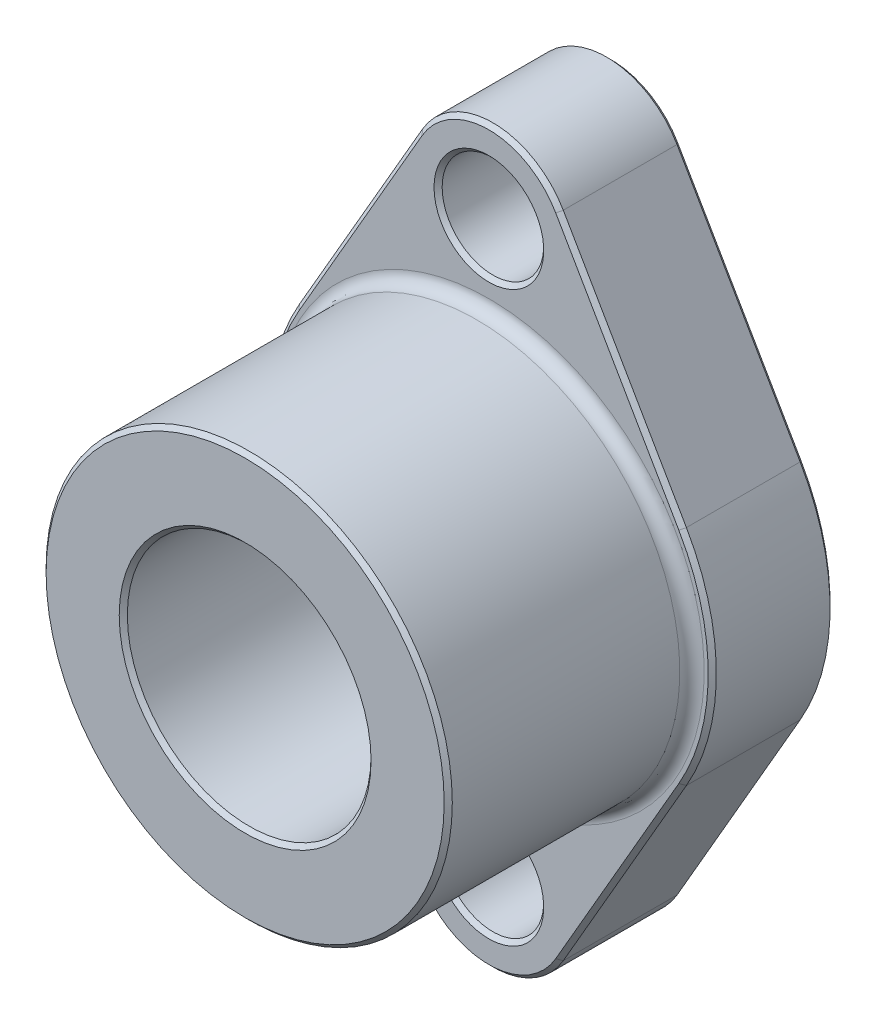
ISO-10303-21;
HEADER;
FILE_DESCRIPTION(('STEP AP214'),'2;1');
FILE_NAME('part.step','',(''),(''),'','','');
FILE_SCHEMA(('AUTOMOTIVE_DESIGN { 1 0 10303 214 1 1 1 1 }'));
ENDSEC;
DATA;
#1=APPLICATION_CONTEXT('core data for automotive mechanical design processes');
#2=APPLICATION_PROTOCOL_DEFINITION('international standard','automotive_design',2000,#1);
#3=PRODUCT_CONTEXT('',#1,'mechanical');
#4=PRODUCT('Part','Part','',(#3));
#5=PRODUCT_RELATED_PRODUCT_CATEGORY('part','',(#4));
#6=PRODUCT_DEFINITION_FORMATION('','',#4);
#7=PRODUCT_DEFINITION_CONTEXT('part definition',#1,'design');
#8=PRODUCT_DEFINITION('design','',#6,#7);
#9=PRODUCT_DEFINITION_SHAPE('','',#8);
#10=(LENGTH_UNIT() NAMED_UNIT(*) SI_UNIT(.MILLI.,.METRE.));
#11=(NAMED_UNIT(*) PLANE_ANGLE_UNIT() SI_UNIT($,.RADIAN.));
#12=(NAMED_UNIT(*) SI_UNIT($,.STERADIAN.) SOLID_ANGLE_UNIT());
#13=UNCERTAINTY_MEASURE_WITH_UNIT(LENGTH_MEASURE(1.E-05),#10,'distance_accuracy_value','');
#14=(GEOMETRIC_REPRESENTATION_CONTEXT(3) GLOBAL_UNCERTAINTY_ASSIGNED_CONTEXT((#13)) GLOBAL_UNIT_ASSIGNED_CONTEXT((#10,
#11,#12)) REPRESENTATION_CONTEXT('',''));
#15=CARTESIAN_POINT('',(0.,0.,0.));
#16=DIRECTION('',(0.,0.,1.));
#17=DIRECTION('',(1.,0.,0.));
#18=AXIS2_PLACEMENT_3D('',#15,#16,#17);
#19=CARTESIAN_POINT('',(0.,0.,6.));
#20=DIRECTION('',(0.,0.,-1.));
#21=DIRECTION('',(-1.,0.,0.));
#22=AXIS2_PLACEMENT_3D('',#19,#20,#21);
#23=CYLINDRICAL_SURFACE('',#22,5.);
#24=CARTESIAN_POINT('',(0.,0.,5.9));
#25=DIRECTION('',(0.,0.,1.));
#26=DIRECTION('',(1.,0.,0.));
#27=AXIS2_PLACEMENT_3D('',#24,#25,#26);
#28=CIRCLE('',#27,5.);
#29=CARTESIAN_POINT('',(5.,0.,5.9));
#30=VERTEX_POINT('',#29);
#31=EDGE_CURVE('E257',#30,#30,#28,.F.);
#32=ORIENTED_EDGE('',*,*,#31,.T.);
#33=EDGE_LOOP('',(#32));
#34=FACE_BOUND('',#33,.T.);
#35=CARTESIAN_POINT('',(0.,0.,0.3));
#36=DIRECTION('',(0.,0.,-1.));
#37=DIRECTION('',(-1.,0.,0.));
#38=AXIS2_PLACEMENT_3D('',#35,#36,#37);
#39=CIRCLE('',#38,5.);
#40=CARTESIAN_POINT('',(-5.,0.,0.3));
#41=VERTEX_POINT('',#40);
#42=EDGE_CURVE('E338',#41,#41,#39,.F.);
#43=ORIENTED_EDGE('',*,*,#42,.T.);
#44=EDGE_LOOP('',(#43));
#45=FACE_BOUND('',#44,.T.);
#46=ADVANCED_FACE('F39',(#34,#45),#23,.T.);
#47=CARTESIAN_POINT('',(0.,0.,6.));
#48=DIRECTION('',(0.,0.,1.));
#49=DIRECTION('',(1.,0.,0.));
#50=AXIS2_PLACEMENT_3D('',#47,#48,#49);
#51=PLANE('',#50);
#52=CARTESIAN_POINT('',(0.,0.,6.));
#53=DIRECTION('',(0.,0.,1.));
#54=DIRECTION('',(1.,0.,0.));
#55=AXIS2_PLACEMENT_3D('',#52,#53,#54);
#56=CIRCLE('',#55,4.9);
#57=CARTESIAN_POINT('',(4.9,0.,6.));
#58=VERTEX_POINT('',#57);
#59=EDGE_CURVE('E254',#58,#58,#56,.T.);
#60=ORIENTED_EDGE('',*,*,#59,.T.);
#61=EDGE_LOOP('',(#60));
#62=FACE_BOUND('',#61,.T.);
#63=CARTESIAN_POINT('',(0.,0.,6.));
#64=DIRECTION('',(0.,0.,1.));
#65=DIRECTION('',(1.,0.,0.));
#66=AXIS2_PLACEMENT_3D('',#63,#64,#65);
#67=CIRCLE('',#66,3.1);
#68=CARTESIAN_POINT('',(3.1,0.,6.));
#69=VERTEX_POINT('',#68);
#70=EDGE_CURVE('E251',#69,#69,#67,.F.);
#71=ORIENTED_EDGE('',*,*,#70,.T.);
#72=EDGE_LOOP('',(#71));
#73=FACE_BOUND('',#72,.T.);
#74=ADVANCED_FACE('F424',(#62,#73),#51,.T.);
#75=CARTESIAN_POINT('',(0.,0.,-3.));
#76=DIRECTION('',(0.,0.,1.));
#77=DIRECTION('',(1.,0.,0.));
#78=AXIS2_PLACEMENT_3D('',#75,#76,#77);
#79=CYLINDRICAL_SURFACE('',#78,5.5);
#80=DIRECTION('',(0.,0.,1.));
#81=VECTOR('',#80,1.);
#82=CARTESIAN_POINT('',(4.76313972081441,-2.75,-3.));
#83=LINE('',#82,#81);
#84=CARTESIAN_POINT('',(4.76313972081441,-2.75,-2.9));
#85=VERTEX_POINT('',#84);
#86=CARTESIAN_POINT('',(4.76313972081441,-2.75,-0.100000000000003));
#87=VERTEX_POINT('',#86);
#88=EDGE_CURVE('E331',#85,#87,#83,.T.);
#89=ORIENTED_EDGE('',*,*,#88,.F.);
#90=CARTESIAN_POINT('',(0.,0.,-2.9));
#91=DIRECTION('',(0.,0.,-1.));
#92=DIRECTION('',(-1.,0.,0.));
#93=AXIS2_PLACEMENT_3D('',#90,#91,#92);
#94=CIRCLE('',#93,5.5);
#95=CARTESIAN_POINT('',(4.76313972081441,2.75,-2.9));
#96=VERTEX_POINT('',#95);
#97=EDGE_CURVE('E217',#85,#96,#94,.F.);
#98=ORIENTED_EDGE('',*,*,#97,.T.);
#99=DIRECTION('',(0.,0.,1.));
#100=VECTOR('',#99,1.);
#101=CARTESIAN_POINT('',(4.76313972081441,2.75,-3.));
#102=LINE('',#101,#100);
#103=CARTESIAN_POINT('',(4.76313972081441,2.75,-0.100000000000003));
#104=VERTEX_POINT('',#103);
#105=EDGE_CURVE('E279',#96,#104,#102,.T.);
#106=ORIENTED_EDGE('',*,*,#105,.T.);
#107=CARTESIAN_POINT('',(0.,0.,-0.100000000000003));
#108=DIRECTION('',(0.,0.,-1.));
#109=DIRECTION('',(-1.,0.,0.));
#110=AXIS2_PLACEMENT_3D('',#107,#108,#109);
#111=CIRCLE('',#110,5.5);
#112=EDGE_CURVE('E215',#104,#87,#111,.T.);
#113=ORIENTED_EDGE('',*,*,#112,.T.);
#114=EDGE_LOOP('',(#89,#98,#106,#113));
#115=FACE_BOUND('',#114,.T.);
#116=ADVANCED_FACE('F330',(#115),#79,.T.);
#117=CARTESIAN_POINT('',(4.76313972081441,-2.75,-3.));
#118=DIRECTION('',(-0.866025403784439,0.5,0.));
#119=DIRECTION('',(-0.5,-0.866025403784439,0.));
#120=AXIS2_PLACEMENT_3D('',#117,#118,#119);
#121=PLANE('',#120);
#122=DIRECTION('',(0.,0.,1.));
#123=VECTOR('',#122,1.);
#124=CARTESIAN_POINT('',(1.73205080756888,-8.,-3.));
#125=LINE('',#124,#123);
#126=CARTESIAN_POINT('',(1.73205080756888,-8.,-2.9));
#127=VERTEX_POINT('',#126);
#128=CARTESIAN_POINT('',(1.73205080756888,-8.,-0.100000000000003));
#129=VERTEX_POINT('',#128);
#130=EDGE_CURVE('E339',#127,#129,#125,.T.);
#131=ORIENTED_EDGE('',*,*,#130,.F.);
#132=DIRECTION('',(0.5,0.866025403784439,0.));
#133=VECTOR('',#132,1.);
#134=CARTESIAN_POINT('',(4.76313972081441,-2.75,-2.9));
#135=LINE('',#134,#133);
#136=EDGE_CURVE('E213',#127,#85,#135,.T.);
#137=ORIENTED_EDGE('',*,*,#136,.T.);
#138=ORIENTED_EDGE('',*,*,#88,.T.);
#139=DIRECTION('',(-0.5,-0.866025403784439,0.));
#140=VECTOR('',#139,1.);
#141=CARTESIAN_POINT('',(4.76313972081441,-2.75,-0.100000000000003));
#142=LINE('',#141,#140);
#143=EDGE_CURVE('E210',#87,#129,#142,.T.);
#144=ORIENTED_EDGE('',*,*,#143,.T.);
#145=EDGE_LOOP('',(#131,#137,#138,#144));
#146=FACE_BOUND('',#145,.T.);
#147=ADVANCED_FACE('F335',(#146),#121,.F.);
#148=CARTESIAN_POINT('',(0.,-7.,-3.));
#149=DIRECTION('',(0.,0.,1.));
#150=DIRECTION('',(1.,0.,0.));
#151=AXIS2_PLACEMENT_3D('',#148,#149,#150);
#152=CYLINDRICAL_SURFACE('',#151,2.);
#153=DIRECTION('',(0.,0.,1.));
#154=VECTOR('',#153,1.);
#155=CARTESIAN_POINT('',(-1.73205080756888,-8.,-3.));
#156=LINE('',#155,#154);
#157=CARTESIAN_POINT('',(-1.73205080756888,-8.,-2.9));
#158=VERTEX_POINT('',#157);
#159=CARTESIAN_POINT('',(-1.73205080756888,-8.,-0.100000000000003));
#160=VERTEX_POINT('',#159);
#161=EDGE_CURVE('E344',#158,#160,#156,.T.);
#162=ORIENTED_EDGE('',*,*,#161,.F.);
#163=CARTESIAN_POINT('',(0.,-7.,-2.9));
#164=DIRECTION('',(0.,0.,-1.));
#165=DIRECTION('',(-1.,0.,0.));
#166=AXIS2_PLACEMENT_3D('',#163,#164,#165);
#167=CIRCLE('',#166,2.);
#168=EDGE_CURVE('E208',#158,#127,#167,.F.);
#169=ORIENTED_EDGE('',*,*,#168,.T.);
#170=ORIENTED_EDGE('',*,*,#130,.T.);
#171=CARTESIAN_POINT('',(0.,-7.,-0.100000000000003));
#172=DIRECTION('',(0.,0.,-1.));
#173=DIRECTION('',(-1.,0.,0.));
#174=AXIS2_PLACEMENT_3D('',#171,#172,#173);
#175=CIRCLE('',#174,2.);
#176=EDGE_CURVE('E206',#129,#160,#175,.T.);
#177=ORIENTED_EDGE('',*,*,#176,.T.);
#178=EDGE_LOOP('',(#162,#169,#170,#177));
#179=FACE_BOUND('',#178,.T.);
#180=ADVANCED_FACE('F551',(#179),#152,.T.);
#181=CARTESIAN_POINT('',(-4.76313972081441,-2.75,-3.));
#182=DIRECTION('',(0.866025403784439,0.5,0.));
#183=DIRECTION('',(-0.5,0.866025403784439,0.));
#184=AXIS2_PLACEMENT_3D('',#181,#182,#183);
#185=PLANE('',#184);
#186=DIRECTION('',(0.,0.,1.));
#187=VECTOR('',#186,1.);
#188=CARTESIAN_POINT('',(-4.76313972081441,-2.75,-3.));
#189=LINE('',#188,#187);
#190=CARTESIAN_POINT('',(-4.76313972081441,-2.75,-2.9));
#191=VERTEX_POINT('',#190);
#192=CARTESIAN_POINT('',(-4.76313972081441,-2.75,-0.100000000000003));
#193=VERTEX_POINT('',#192);
#194=EDGE_CURVE('E391',#191,#193,#189,.T.);
#195=ORIENTED_EDGE('',*,*,#194,.F.);
#196=DIRECTION('',(0.5,-0.866025403784439,0.));
#197=VECTOR('',#196,1.);
#198=CARTESIAN_POINT('',(-1.73205080756888,-8.,-2.9));
#199=LINE('',#198,#197);
#200=EDGE_CURVE('E204',#191,#158,#199,.T.);
#201=ORIENTED_EDGE('',*,*,#200,.T.);
#202=ORIENTED_EDGE('',*,*,#161,.T.);
#203=DIRECTION('',(-0.5,0.866025403784439,0.));
#204=VECTOR('',#203,1.);
#205=CARTESIAN_POINT('',(-4.76313972081441,-2.75,-0.100000000000003));
#206=LINE('',#205,#204);
#207=EDGE_CURVE('E202',#160,#193,#206,.T.);
#208=ORIENTED_EDGE('',*,*,#207,.T.);
#209=EDGE_LOOP('',(#195,#201,#202,#208));
#210=FACE_BOUND('',#209,.T.);
#211=ADVANCED_FACE('F398',(#210),#185,.F.);
#212=CARTESIAN_POINT('',(0.,0.,-3.));
#213=DIRECTION('',(0.,0.,1.));
#214=DIRECTION('',(1.,0.,0.));
#215=AXIS2_PLACEMENT_3D('',#212,#213,#214);
#216=CYLINDRICAL_SURFACE('',#215,5.5);
#217=DIRECTION('',(0.,0.,1.));
#218=VECTOR('',#217,1.);
#219=CARTESIAN_POINT('',(-4.76313972081441,2.75,-3.));
#220=LINE('',#219,#218);
#221=CARTESIAN_POINT('',(-4.76313972081441,2.75,-2.9));
#222=VERTEX_POINT('',#221);
#223=CARTESIAN_POINT('',(-4.76313972081441,2.75,-0.100000000000003));
#224=VERTEX_POINT('',#223);
#225=EDGE_CURVE('E385',#222,#224,#220,.T.);
#226=ORIENTED_EDGE('',*,*,#225,.F.);
#227=CARTESIAN_POINT('',(0.,0.,-2.9));
#228=DIRECTION('',(0.,0.,-1.));
#229=DIRECTION('',(-1.,0.,0.));
#230=AXIS2_PLACEMENT_3D('',#227,#228,#229);
#231=CIRCLE('',#230,5.5);
#232=EDGE_CURVE('E200',#222,#191,#231,.F.);
#233=ORIENTED_EDGE('',*,*,#232,.T.);
#234=ORIENTED_EDGE('',*,*,#194,.T.);
#235=CARTESIAN_POINT('',(0.,0.,-0.100000000000003));
#236=DIRECTION('',(0.,0.,-1.));
#237=DIRECTION('',(-1.,0.,0.));
#238=AXIS2_PLACEMENT_3D('',#235,#236,#237);
#239=CIRCLE('',#238,5.5);
#240=EDGE_CURVE('E198',#193,#224,#239,.T.);
#241=ORIENTED_EDGE('',*,*,#240,.T.);
#242=EDGE_LOOP('',(#226,#233,#234,#241));
#243=FACE_BOUND('',#242,.T.);
#244=ADVANCED_FACE('F544',(#243),#216,.T.);
#245=CARTESIAN_POINT('',(-4.76313972081441,2.75,-3.));
#246=DIRECTION('',(0.866025403784439,-0.5,0.));
#247=DIRECTION('',(0.5,0.866025403784439,0.));
#248=AXIS2_PLACEMENT_3D('',#245,#246,#247);
#249=PLANE('',#248);
#250=DIRECTION('',(0.,0.,1.));
#251=VECTOR('',#250,1.);
#252=CARTESIAN_POINT('',(-1.73205080756888,8.,-3.));
#253=LINE('',#252,#251);
#254=CARTESIAN_POINT('',(-1.73205080756888,8.,-2.9));
#255=VERTEX_POINT('',#254);
#256=CARTESIAN_POINT('',(-1.73205080756888,8.,-0.100000000000003));
#257=VERTEX_POINT('',#256);
#258=EDGE_CURVE('E383',#255,#257,#253,.T.);
#259=ORIENTED_EDGE('',*,*,#258,.F.);
#260=DIRECTION('',(-0.5,-0.866025403784439,0.));
#261=VECTOR('',#260,1.);
#262=CARTESIAN_POINT('',(-4.76313972081441,2.75,-2.9));
#263=LINE('',#262,#261);
#264=EDGE_CURVE('E196',#255,#222,#263,.T.);
#265=ORIENTED_EDGE('',*,*,#264,.T.);
#266=ORIENTED_EDGE('',*,*,#225,.T.);
#267=DIRECTION('',(0.5,0.866025403784439,0.));
#268=VECTOR('',#267,1.);
#269=CARTESIAN_POINT('',(-4.76313972081441,2.75,-0.100000000000003));
#270=LINE('',#269,#268);
#271=EDGE_CURVE('E194',#224,#257,#270,.T.);
#272=ORIENTED_EDGE('',*,*,#271,.T.);
#273=EDGE_LOOP('',(#259,#265,#266,#272));
#274=FACE_BOUND('',#273,.T.);
#275=ADVANCED_FACE('F541',(#274),#249,.F.);
#276=CARTESIAN_POINT('',(0.,7.,-3.));
#277=DIRECTION('',(0.,0.,1.));
#278=DIRECTION('',(1.,0.,0.));
#279=AXIS2_PLACEMENT_3D('',#276,#277,#278);
#280=CYLINDRICAL_SURFACE('',#279,2.);
#281=DIRECTION('',(0.,0.,1.));
#282=VECTOR('',#281,1.);
#283=CARTESIAN_POINT('',(1.73205080756888,8.,-3.));
#284=LINE('',#283,#282);
#285=CARTESIAN_POINT('',(1.73205080756888,8.,-2.9));
#286=VERTEX_POINT('',#285);
#287=CARTESIAN_POINT('',(1.73205080756888,8.,-0.100000000000003));
#288=VERTEX_POINT('',#287);
#289=EDGE_CURVE('E381',#286,#288,#284,.T.);
#290=ORIENTED_EDGE('',*,*,#289,.F.);
#291=CARTESIAN_POINT('',(0.,7.,-2.9));
#292=DIRECTION('',(0.,0.,-1.));
#293=DIRECTION('',(-1.,0.,0.));
#294=AXIS2_PLACEMENT_3D('',#291,#292,#293);
#295=CIRCLE('',#294,2.);
#296=EDGE_CURVE('E192',#286,#255,#295,.F.);
#297=ORIENTED_EDGE('',*,*,#296,.T.);
#298=ORIENTED_EDGE('',*,*,#258,.T.);
#299=CARTESIAN_POINT('',(0.,7.,-0.100000000000003));
#300=DIRECTION('',(0.,0.,-1.));
#301=DIRECTION('',(-1.,0.,0.));
#302=AXIS2_PLACEMENT_3D('',#299,#300,#301);
#303=CIRCLE('',#302,2.);
#304=EDGE_CURVE('E190',#257,#288,#303,.T.);
#305=ORIENTED_EDGE('',*,*,#304,.T.);
#306=EDGE_LOOP('',(#290,#297,#298,#305));
#307=FACE_BOUND('',#306,.T.);
#308=ADVANCED_FACE('F382',(#307),#280,.T.);
#309=CARTESIAN_POINT('',(4.76313972081441,2.75,-3.));
#310=DIRECTION('',(-0.866025403784439,-0.5,0.));
#311=DIRECTION('',(0.5,-0.866025403784439,0.));
#312=AXIS2_PLACEMENT_3D('',#309,#310,#311);
#313=PLANE('',#312);
#314=ORIENTED_EDGE('',*,*,#105,.F.);
#315=DIRECTION('',(-0.5,0.866025403784439,0.));
#316=VECTOR('',#315,1.);
#317=CARTESIAN_POINT('',(1.73205080756888,8.,-2.9));
#318=LINE('',#317,#316);
#319=EDGE_CURVE('E162',#96,#286,#318,.T.);
#320=ORIENTED_EDGE('',*,*,#319,.T.);
#321=ORIENTED_EDGE('',*,*,#289,.T.);
#322=DIRECTION('',(0.5,-0.866025403784439,0.));
#323=VECTOR('',#322,1.);
#324=CARTESIAN_POINT('',(4.76313972081441,2.75,-0.100000000000003));
#325=LINE('',#324,#323);
#326=EDGE_CURVE('E182',#288,#104,#325,.T.);
#327=ORIENTED_EDGE('',*,*,#326,.T.);
#328=EDGE_LOOP('',(#314,#320,#321,#327));
#329=FACE_BOUND('',#328,.T.);
#330=ADVANCED_FACE('F380',(#329),#313,.F.);
#331=CARTESIAN_POINT('',(0.,0.,-3.));
#332=DIRECTION('',(0.,0.,-1.));
#333=DIRECTION('',(-1.,0.,0.));
#334=AXIS2_PLACEMENT_3D('',#331,#332,#333);
#335=PLANE('',#334);
#336=CARTESIAN_POINT('',(0.,7.,-3.));
#337=DIRECTION('',(0.,0.,-1.));
#338=DIRECTION('',(-1.,0.,0.));
#339=AXIS2_PLACEMENT_3D('',#336,#337,#338);
#340=CIRCLE('',#339,1.9);
#341=CARTESIAN_POINT('',(-1.64544826719043,7.95,-3.));
#342=VERTEX_POINT('',#341);
#343=CARTESIAN_POINT('',(1.64544826719043,7.95,-3.));
#344=VERTEX_POINT('',#343);
#345=EDGE_CURVE('E180',#342,#344,#340,.T.);
#346=ORIENTED_EDGE('',*,*,#345,.T.);
#347=DIRECTION('',(0.5,-0.866025403784439,0.));
#348=VECTOR('',#347,1.);
#349=CARTESIAN_POINT('',(4.67653718043597,2.7,-3.));
#350=LINE('',#349,#348);
#351=CARTESIAN_POINT('',(4.67653718043597,2.7,-3.));
#352=VERTEX_POINT('',#351);
#353=EDGE_CURVE('E160',#344,#352,#350,.T.);
#354=ORIENTED_EDGE('',*,*,#353,.T.);
#355=CARTESIAN_POINT('',(0.,0.,-3.));
#356=DIRECTION('',(0.,0.,-1.));
#357=DIRECTION('',(-1.,0.,0.));
#358=AXIS2_PLACEMENT_3D('',#355,#356,#357);
#359=CIRCLE('',#358,5.4);
#360=CARTESIAN_POINT('',(4.67653718043597,-2.7,-3.));
#361=VERTEX_POINT('',#360);
#362=EDGE_CURVE('E168',#352,#361,#359,.T.);
#363=ORIENTED_EDGE('',*,*,#362,.T.);
#364=DIRECTION('',(-0.5,-0.866025403784439,0.));
#365=VECTOR('',#364,1.);
#366=CARTESIAN_POINT('',(1.64544826719043,-7.95,-3.));
#367=LINE('',#366,#365);
#368=CARTESIAN_POINT('',(1.64544826719043,-7.95,-3.));
#369=VERTEX_POINT('',#368);
#370=EDGE_CURVE('E174',#361,#369,#367,.T.);
#371=ORIENTED_EDGE('',*,*,#370,.T.);
#372=CARTESIAN_POINT('',(0.,-7.,-3.));
#373=DIRECTION('',(0.,0.,-1.));
#374=DIRECTION('',(-1.,0.,0.));
#375=AXIS2_PLACEMENT_3D('',#372,#373,#374);
#376=CIRCLE('',#375,1.9);
#377=CARTESIAN_POINT('',(-1.64544826719043,-7.95,-3.));
#378=VERTEX_POINT('',#377);
#379=EDGE_CURVE('E359',#369,#378,#376,.T.);
#380=ORIENTED_EDGE('',*,*,#379,.T.);
#381=DIRECTION('',(-0.5,0.866025403784439,0.));
#382=VECTOR('',#381,1.);
#383=CARTESIAN_POINT('',(-4.67653718043597,-2.7,-3.));
#384=LINE('',#383,#382);
#385=CARTESIAN_POINT('',(-4.67653718043597,-2.7,-3.));
#386=VERTEX_POINT('',#385);
#387=EDGE_CURVE('E361',#378,#386,#384,.T.);
#388=ORIENTED_EDGE('',*,*,#387,.T.);
#389=CARTESIAN_POINT('',(0.,0.,-3.));
#390=DIRECTION('',(0.,0.,-1.));
#391=DIRECTION('',(-1.,0.,0.));
#392=AXIS2_PLACEMENT_3D('',#389,#390,#391);
#393=CIRCLE('',#392,5.4);
#394=CARTESIAN_POINT('',(-4.67653718043597,2.7,-3.));
#395=VERTEX_POINT('',#394);
#396=EDGE_CURVE('E363',#386,#395,#393,.T.);
#397=ORIENTED_EDGE('',*,*,#396,.T.);
#398=DIRECTION('',(0.5,0.866025403784439,0.));
#399=VECTOR('',#398,1.);
#400=CARTESIAN_POINT('',(-1.64544826719043,7.95,-3.));
#401=LINE('',#400,#399);
#402=EDGE_CURVE('E185',#395,#342,#401,.T.);
#403=ORIENTED_EDGE('',*,*,#402,.T.);
#404=EDGE_LOOP('',(#346,#354,#363,#371,#380,#388,#397,#403));
#405=FACE_BOUND('',#404,.T.);
#406=CARTESIAN_POINT('',(0.,7.,-3.));
#407=DIRECTION('',(0.,0.,-1.));
#408=DIRECTION('',(-1.,0.,0.));
#409=AXIS2_PLACEMENT_3D('',#406,#407,#408);
#410=CIRCLE('',#409,1.35);
#411=CARTESIAN_POINT('',(-1.35,7.,-3.));
#412=VERTEX_POINT('',#411);
#413=EDGE_CURVE('E175',#412,#412,#410,.F.);
#414=ORIENTED_EDGE('',*,*,#413,.T.);
#415=EDGE_LOOP('',(#414));
#416=FACE_BOUND('',#415,.T.);
#417=CARTESIAN_POINT('',(0.,-7.,-3.));
#418=DIRECTION('',(0.,0.,-1.));
#419=DIRECTION('',(-1.,0.,0.));
#420=AXIS2_PLACEMENT_3D('',#417,#418,#419);
#421=CIRCLE('',#420,1.35);
#422=CARTESIAN_POINT('',(-1.35,-7.,-3.));
#423=VERTEX_POINT('',#422);
#424=EDGE_CURVE('E353',#423,#423,#421,.F.);
#425=ORIENTED_EDGE('',*,*,#424,.T.);
#426=EDGE_LOOP('',(#425));
#427=FACE_BOUND('',#426,.T.);
#428=CARTESIAN_POINT('',(0.,0.,-3.));
#429=DIRECTION('',(0.,0.,-1.));
#430=DIRECTION('',(-1.,0.,0.));
#431=AXIS2_PLACEMENT_3D('',#428,#429,#430);
#432=CIRCLE('',#431,3.1);
#433=CARTESIAN_POINT('',(-3.1,0.,-3.));
#434=VERTEX_POINT('',#433);
#435=EDGE_CURVE('E350',#434,#434,#432,.F.);
#436=ORIENTED_EDGE('',*,*,#435,.T.);
#437=EDGE_LOOP('',(#436));
#438=FACE_BOUND('',#437,.T.);
#439=ADVANCED_FACE('F177',(#405,#416,#427,#438),#335,.T.);
#440=CARTESIAN_POINT('',(0.,0.,0.));
#441=DIRECTION('',(0.,0.,-1.));
#442=DIRECTION('',(-1.,0.,0.));
#443=AXIS2_PLACEMENT_3D('',#440,#441,#442);
#444=PLANE('',#443);
#445=CARTESIAN_POINT('',(0.,-7.,0.));
#446=DIRECTION('',(0.,0.,-1.));
#447=DIRECTION('',(-1.,0.,0.));
#448=AXIS2_PLACEMENT_3D('',#445,#446,#447);
#449=CIRCLE('',#448,1.9);
#450=CARTESIAN_POINT('',(-1.64544826719043,-7.95,0.));
#451=VERTEX_POINT('',#450);
#452=CARTESIAN_POINT('',(1.64544826719043,-7.95,0.));
#453=VERTEX_POINT('',#452);
#454=EDGE_CURVE('E57',#451,#453,#449,.F.);
#455=ORIENTED_EDGE('',*,*,#454,.T.);
#456=DIRECTION('',(0.5,0.866025403784439,0.));
#457=VECTOR('',#456,1.);
#458=CARTESIAN_POINT('',(4.67653718043597,-2.7,0.));
#459=LINE('',#458,#457);
#460=CARTESIAN_POINT('',(4.67653718043596,-2.7,0.));
#461=VERTEX_POINT('',#460);
#462=EDGE_CURVE('E249',#453,#461,#459,.T.);
#463=ORIENTED_EDGE('',*,*,#462,.T.);
#464=CARTESIAN_POINT('',(0.,0.,0.));
#465=DIRECTION('',(0.,0.,-1.));
#466=DIRECTION('',(-1.,0.,0.));
#467=AXIS2_PLACEMENT_3D('',#464,#465,#466);
#468=CIRCLE('',#467,5.4);
#469=CARTESIAN_POINT('',(4.67653718043596,2.7,0.));
#470=VERTEX_POINT('',#469);
#471=EDGE_CURVE('E237',#461,#470,#468,.F.);
#472=ORIENTED_EDGE('',*,*,#471,.T.);
#473=DIRECTION('',(-0.5,0.866025403784439,0.));
#474=VECTOR('',#473,1.);
#475=CARTESIAN_POINT('',(4.67653718043597,2.7,0.));
#476=LINE('',#475,#474);
#477=CARTESIAN_POINT('',(1.64544826719043,7.95,0.));
#478=VERTEX_POINT('',#477);
#479=EDGE_CURVE('E239',#470,#478,#476,.T.);
#480=ORIENTED_EDGE('',*,*,#479,.T.);
#481=CARTESIAN_POINT('',(0.,7.,0.));
#482=DIRECTION('',(0.,0.,-1.));
#483=DIRECTION('',(-1.,0.,0.));
#484=AXIS2_PLACEMENT_3D('',#481,#482,#483);
#485=CIRCLE('',#484,1.9);
#486=CARTESIAN_POINT('',(-1.64544826719043,7.95,0.));
#487=VERTEX_POINT('',#486);
#488=EDGE_CURVE('E241',#478,#487,#485,.F.);
#489=ORIENTED_EDGE('',*,*,#488,.T.);
#490=DIRECTION('',(-0.5,-0.866025403784439,0.));
#491=VECTOR('',#490,1.);
#492=CARTESIAN_POINT('',(-4.67653718043597,2.7,0.));
#493=LINE('',#492,#491);
#494=CARTESIAN_POINT('',(-4.67653718043597,2.7,0.));
#495=VERTEX_POINT('',#494);
#496=EDGE_CURVE('E243',#487,#495,#493,.T.);
#497=ORIENTED_EDGE('',*,*,#496,.T.);
#498=CARTESIAN_POINT('',(0.,0.,0.));
#499=DIRECTION('',(0.,0.,-1.));
#500=DIRECTION('',(-1.,0.,0.));
#501=AXIS2_PLACEMENT_3D('',#498,#499,#500);
#502=CIRCLE('',#501,5.4);
#503=CARTESIAN_POINT('',(-4.67653718043596,-2.7,0.));
#504=VERTEX_POINT('',#503);
#505=EDGE_CURVE('E245',#495,#504,#502,.F.);
#506=ORIENTED_EDGE('',*,*,#505,.T.);
#507=DIRECTION('',(0.5,-0.866025403784439,0.));
#508=VECTOR('',#507,1.);
#509=CARTESIAN_POINT('',(-4.67653718043596,-2.7,0.));
#510=LINE('',#509,#508);
#511=EDGE_CURVE('E62',#504,#451,#510,.T.);
#512=ORIENTED_EDGE('',*,*,#511,.T.);
#513=EDGE_LOOP('',(#455,#463,#472,#480,#489,#497,#506,#512));
#514=FACE_BOUND('',#513,.T.);
#515=CARTESIAN_POINT('',(0.,7.,0.));
#516=DIRECTION('',(0.,0.,-1.));
#517=DIRECTION('',(-1.,0.,0.));
#518=AXIS2_PLACEMENT_3D('',#515,#516,#517);
#519=CIRCLE('',#518,1.35);
#520=CARTESIAN_POINT('',(-1.35,7.,0.));
#521=VERTEX_POINT('',#520);
#522=EDGE_CURVE('E234',#521,#521,#519,.T.);
#523=ORIENTED_EDGE('',*,*,#522,.T.);
#524=EDGE_LOOP('',(#523));
#525=FACE_BOUND('',#524,.T.);
#526=CARTESIAN_POINT('',(0.,-7.,0.));
#527=DIRECTION('',(0.,0.,-1.));
#528=DIRECTION('',(-1.,0.,0.));
#529=AXIS2_PLACEMENT_3D('',#526,#527,#528);
#530=CIRCLE('',#529,1.35);
#531=CARTESIAN_POINT('',(-1.35,-7.,0.));
#532=VERTEX_POINT('',#531);
#533=EDGE_CURVE('E231',#532,#532,#530,.T.);
#534=ORIENTED_EDGE('',*,*,#533,.T.);
#535=EDGE_LOOP('',(#534));
#536=FACE_BOUND('',#535,.T.);
#537=CARTESIAN_POINT('',(0.,0.,0.));
#538=DIRECTION('',(0.,0.,-1.));
#539=DIRECTION('',(-1.,0.,0.));
#540=AXIS2_PLACEMENT_3D('',#537,#538,#539);
#541=CIRCLE('',#540,5.3);
#542=CARTESIAN_POINT('',(-5.3,0.,0.));
#543=VERTEX_POINT('',#542);
#544=EDGE_CURVE('E342',#543,#543,#541,.T.);
#545=ORIENTED_EDGE('',*,*,#544,.T.);
#546=EDGE_LOOP('',(#545));
#547=FACE_BOUND('',#546,.T.);
#548=ADVANCED_FACE('F312',(#514,#525,#536,#547),#444,.F.);
#549=CARTESIAN_POINT('',(0.,7.,6.));
#550=DIRECTION('',(0.,0.,-1.));
#551=DIRECTION('',(-1.,0.,0.));
#552=AXIS2_PLACEMENT_3D('',#549,#550,#551);
#553=CYLINDRICAL_SURFACE('',#552,1.25);
#554=CARTESIAN_POINT('',(0.,7.,-2.9));
#555=DIRECTION('',(0.,0.,-1.));
#556=DIRECTION('',(-1.,0.,0.));
#557=AXIS2_PLACEMENT_3D('',#554,#555,#556);
#558=CIRCLE('',#557,1.25);
#559=CARTESIAN_POINT('',(-1.25,7.,-2.9));
#560=VERTEX_POINT('',#559);
#561=EDGE_CURVE('E222',#560,#560,#558,.T.);
#562=ORIENTED_EDGE('',*,*,#561,.T.);
#563=EDGE_LOOP('',(#562));
#564=FACE_BOUND('',#563,.T.);
#565=CARTESIAN_POINT('',(0.,7.,-0.0999999999999985));
#566=DIRECTION('',(0.,0.,-1.));
#567=DIRECTION('',(-1.,0.,0.));
#568=AXIS2_PLACEMENT_3D('',#565,#566,#567);
#569=CIRCLE('',#568,1.25);
#570=CARTESIAN_POINT('',(-1.25,7.,-0.0999999999999985));
#571=VERTEX_POINT('',#570);
#572=EDGE_CURVE('E219',#571,#571,#569,.F.);
#573=ORIENTED_EDGE('',*,*,#572,.T.);
#574=EDGE_LOOP('',(#573));
#575=FACE_BOUND('',#574,.T.);
#576=ADVANCED_FACE('F512',(#564,#575),#553,.F.);
#577=CARTESIAN_POINT('',(0.,-7.,6.));
#578=DIRECTION('',(0.,0.,-1.));
#579=DIRECTION('',(-1.,0.,0.));
#580=AXIS2_PLACEMENT_3D('',#577,#578,#579);
#581=CYLINDRICAL_SURFACE('',#580,1.25);
#582=CARTESIAN_POINT('',(0.,-7.,-2.9));
#583=DIRECTION('',(0.,0.,-1.));
#584=DIRECTION('',(-1.,0.,0.));
#585=AXIS2_PLACEMENT_3D('',#582,#583,#584);
#586=CIRCLE('',#585,1.25);
#587=CARTESIAN_POINT('',(-1.25,-7.,-2.9));
#588=VERTEX_POINT('',#587);
#589=EDGE_CURVE('E228',#588,#588,#586,.T.);
#590=ORIENTED_EDGE('',*,*,#589,.T.);
#591=EDGE_LOOP('',(#590));
#592=FACE_BOUND('',#591,.T.);
#593=CARTESIAN_POINT('',(0.,-7.,-0.0999999999999985));
#594=DIRECTION('',(0.,0.,-1.));
#595=DIRECTION('',(-1.,0.,0.));
#596=AXIS2_PLACEMENT_3D('',#593,#594,#595);
#597=CIRCLE('',#596,1.25);
#598=CARTESIAN_POINT('',(-1.25,-7.,-0.0999999999999985));
#599=VERTEX_POINT('',#598);
#600=EDGE_CURVE('E225',#599,#599,#597,.F.);
#601=ORIENTED_EDGE('',*,*,#600,.T.);
#602=EDGE_LOOP('',(#601));
#603=FACE_BOUND('',#602,.T.);
#604=ADVANCED_FACE('F509',(#592,#603),#581,.F.);
#605=CARTESIAN_POINT('',(0.,0.,6.));
#606=DIRECTION('',(0.,0.,-1.));
#607=DIRECTION('',(-1.,0.,0.));
#608=AXIS2_PLACEMENT_3D('',#605,#606,#607);
#609=CYLINDRICAL_SURFACE('',#608,3.);
#610=CARTESIAN_POINT('',(0.,0.,-2.9));
#611=DIRECTION('',(0.,0.,-1.));
#612=DIRECTION('',(-1.,0.,0.));
#613=AXIS2_PLACEMENT_3D('',#610,#611,#612);
#614=CIRCLE('',#613,3.);
#615=CARTESIAN_POINT('',(-3.,0.,-2.9));
#616=VERTEX_POINT('',#615);
#617=EDGE_CURVE('E11',#616,#616,#614,.T.);
#618=ORIENTED_EDGE('',*,*,#617,.T.);
#619=EDGE_LOOP('',(#618));
#620=FACE_BOUND('',#619,.T.);
#621=CARTESIAN_POINT('',(0.,0.,5.9));
#622=DIRECTION('',(0.,0.,1.));
#623=DIRECTION('',(1.,0.,0.));
#624=AXIS2_PLACEMENT_3D('',#621,#622,#623);
#625=CIRCLE('',#624,3.);
#626=CARTESIAN_POINT('',(3.,0.,5.9));
#627=VERTEX_POINT('',#626);
#628=EDGE_CURVE('E49',#627,#627,#625,.T.);
#629=ORIENTED_EDGE('',*,*,#628,.T.);
#630=EDGE_LOOP('',(#629));
#631=FACE_BOUND('',#630,.T.);
#632=ADVANCED_FACE('F439',(#620,#631),#609,.F.);
#633=CARTESIAN_POINT('',(0.,0.,0.3));
#634=DIRECTION('',(0.,0.,-1.));
#635=DIRECTION('',(-1.,0.,0.));
#636=AXIS2_PLACEMENT_3D('',#633,#634,#635);
#637=TOROIDAL_SURFACE('',#636,5.3,0.3);
#638=ORIENTED_EDGE('',*,*,#544,.F.);
#639=EDGE_LOOP('',(#638));
#640=FACE_BOUND('',#639,.T.);
#641=ORIENTED_EDGE('',*,*,#42,.F.);
#642=EDGE_LOOP('',(#641));
#643=FACE_BOUND('',#642,.T.);
#644=ADVANCED_FACE('F435',(#640,#643),#637,.F.);
#645=CARTESIAN_POINT('',(-4.67653718043597,-2.7,-3.));
#646=DIRECTION('',(-0.61237243569579,-0.353553390593271,-0.707106781186553));
#647=DIRECTION('',(0.5,-0.866025403784439,0.));
#648=AXIS2_PLACEMENT_3D('',#645,#646,#647);
#649=PLANE('',#648);
#650=DIRECTION('',(0.612372435695802,0.353553390593277,-0.70710678118654));
#651=VECTOR('',#650,1.);
#652=CARTESIAN_POINT('',(-1.73205080756888,-8.,-2.9));
#653=LINE('',#652,#651);
#654=EDGE_CURVE('E273',#158,#378,#653,.T.);
#655=ORIENTED_EDGE('',*,*,#654,.F.);
#656=ORIENTED_EDGE('',*,*,#200,.F.);
#657=DIRECTION('',(-0.612372435695801,-0.353553390593278,0.70710678118654));
#658=VECTOR('',#657,1.);
#659=CARTESIAN_POINT('',(-4.67653718043597,-2.7,-3.));
#660=LINE('',#659,#658);
#661=EDGE_CURVE('E276',#386,#191,#660,.T.);
#662=ORIENTED_EDGE('',*,*,#661,.F.);
#663=ORIENTED_EDGE('',*,*,#387,.F.);
#664=EDGE_LOOP('',(#655,#656,#662,#663));
#665=FACE_BOUND('',#664,.T.);
#666=ADVANCED_FACE('F438',(#665),#649,.T.);
#667=CARTESIAN_POINT('',(0.,0.,-3.));
#668=DIRECTION('',(0.,0.,1.));
#669=DIRECTION('',(1.,0.,0.));
#670=AXIS2_PLACEMENT_3D('',#667,#668,#669);
#671=CONICAL_SURFACE('',#670,5.4,0.785398163397461);
#672=ORIENTED_EDGE('',*,*,#661,.T.);
#673=ORIENTED_EDGE('',*,*,#232,.F.);
#674=DIRECTION('',(-0.612372435695805,0.353553390593282,0.707106781186534));
#675=VECTOR('',#674,1.);
#676=CARTESIAN_POINT('',(-4.67653718043597,2.7,-3.));
#677=LINE('',#676,#675);
#678=EDGE_CURVE('E270',#395,#222,#677,.T.);
#679=ORIENTED_EDGE('',*,*,#678,.F.);
#680=ORIENTED_EDGE('',*,*,#396,.F.);
#681=EDGE_LOOP('',(#672,#673,#679,#680));
#682=FACE_BOUND('',#681,.T.);
#683=ADVANCED_FACE('F477',(#682),#671,.T.);
#684=CARTESIAN_POINT('',(0.,-7.,-3.));
#685=DIRECTION('',(0.,0.,1.));
#686=DIRECTION('',(1.,0.,0.));
#687=AXIS2_PLACEMENT_3D('',#684,#685,#686);
#688=CONICAL_SURFACE('',#687,1.9,0.785398163397457);
#689=ORIENTED_EDGE('',*,*,#654,.T.);
#690=ORIENTED_EDGE('',*,*,#379,.F.);
#691=DIRECTION('',(-0.612372435695799,0.353553390593277,-0.707106781186542));
#692=VECTOR('',#691,1.);
#693=CARTESIAN_POINT('',(1.73205080756888,-8.,-2.9));
#694=LINE('',#693,#692);
#695=EDGE_CURVE('E267',#127,#369,#694,.T.);
#696=ORIENTED_EDGE('',*,*,#695,.F.);
#697=ORIENTED_EDGE('',*,*,#168,.F.);
#698=EDGE_LOOP('',(#689,#690,#696,#697));
#699=FACE_BOUND('',#698,.T.);
#700=ADVANCED_FACE('F471',(#699),#688,.T.);
#701=CARTESIAN_POINT('',(-4.67653718043597,2.7,-3.));
#702=DIRECTION('',(-0.612372435695789,0.353553390593271,-0.707106781186553));
#703=DIRECTION('',(-0.5,-0.866025403784439,0.));
#704=AXIS2_PLACEMENT_3D('',#701,#702,#703);
#705=PLANE('',#704);
#706=ORIENTED_EDGE('',*,*,#678,.T.);
#707=ORIENTED_EDGE('',*,*,#264,.F.);
#708=DIRECTION('',(-0.612372435695799,0.353553390593277,0.707106781186542));
#709=VECTOR('',#708,1.);
#710=CARTESIAN_POINT('',(-1.64544826719043,7.95,-3.));
#711=LINE('',#710,#709);
#712=EDGE_CURVE('E264',#342,#255,#711,.T.);
#713=ORIENTED_EDGE('',*,*,#712,.F.);
#714=ORIENTED_EDGE('',*,*,#402,.F.);
#715=EDGE_LOOP('',(#706,#707,#713,#714));
#716=FACE_BOUND('',#715,.T.);
#717=ADVANCED_FACE('F370',(#716),#705,.T.);
#718=CARTESIAN_POINT('',(4.67653718043597,-2.7,-3.));
#719=DIRECTION('',(0.61237243569579,-0.353553390593271,-0.707106781186553));
#720=DIRECTION('',(0.5,0.866025403784439,0.));
#721=AXIS2_PLACEMENT_3D('',#718,#719,#720);
#722=PLANE('',#721);
#723=ORIENTED_EDGE('',*,*,#695,.T.);
#724=ORIENTED_EDGE('',*,*,#370,.F.);
#725=DIRECTION('',(-0.612372435695796,0.353553390593276,-0.707106781186545));
#726=VECTOR('',#725,1.);
#727=CARTESIAN_POINT('',(4.76313972081441,-2.75,-2.9));
#728=LINE('',#727,#726);
#729=EDGE_CURVE('E171',#85,#361,#728,.T.);
#730=ORIENTED_EDGE('',*,*,#729,.F.);
#731=ORIENTED_EDGE('',*,*,#136,.F.);
#732=EDGE_LOOP('',(#723,#724,#730,#731));
#733=FACE_BOUND('',#732,.T.);
#734=ADVANCED_FACE('F459',(#733),#722,.T.);
#735=CARTESIAN_POINT('',(0.,7.,-3.));
#736=DIRECTION('',(0.,0.,1.));
#737=DIRECTION('',(1.,0.,0.));
#738=AXIS2_PLACEMENT_3D('',#735,#736,#737);
#739=CONICAL_SURFACE('',#738,1.9,0.785398163397457);
#740=ORIENTED_EDGE('',*,*,#712,.T.);
#741=ORIENTED_EDGE('',*,*,#296,.F.);
#742=DIRECTION('',(0.6123724356958,0.353553390593277,0.707106781186541));
#743=VECTOR('',#742,1.);
#744=CARTESIAN_POINT('',(1.64544826719043,7.95,-3.));
#745=LINE('',#744,#743);
#746=EDGE_CURVE('E165',#344,#286,#745,.T.);
#747=ORIENTED_EDGE('',*,*,#746,.F.);
#748=ORIENTED_EDGE('',*,*,#345,.F.);
#749=EDGE_LOOP('',(#740,#741,#747,#748));
#750=FACE_BOUND('',#749,.T.);
#751=ADVANCED_FACE('F373',(#750),#739,.T.);
#752=CARTESIAN_POINT('',(0.,0.,-3.));
#753=DIRECTION('',(0.,0.,1.));
#754=DIRECTION('',(1.,0.,0.));
#755=AXIS2_PLACEMENT_3D('',#752,#753,#754);
#756=CONICAL_SURFACE('',#755,5.4,0.785398163397453);
#757=ORIENTED_EDGE('',*,*,#729,.T.);
#758=ORIENTED_EDGE('',*,*,#362,.F.);
#759=DIRECTION('',(-0.612372435695796,-0.353553390593276,-0.707106781186545));
#760=VECTOR('',#759,1.);
#761=CARTESIAN_POINT('',(4.76313972081441,2.75,-2.9));
#762=LINE('',#761,#760);
#763=EDGE_CURVE('E156',#96,#352,#762,.T.);
#764=ORIENTED_EDGE('',*,*,#763,.F.);
#765=ORIENTED_EDGE('',*,*,#97,.F.);
#766=EDGE_LOOP('',(#757,#758,#764,#765));
#767=FACE_BOUND('',#766,.T.);
#768=ADVANCED_FACE('F169',(#767),#756,.T.);
#769=CARTESIAN_POINT('',(4.67653718043597,2.7,-3.));
#770=DIRECTION('',(0.612372435695789,0.353553390593271,-0.707106781186553));
#771=DIRECTION('',(-0.5,0.866025403784439,0.));
#772=AXIS2_PLACEMENT_3D('',#769,#770,#771);
#773=PLANE('',#772);
#774=ORIENTED_EDGE('',*,*,#746,.T.);
#775=ORIENTED_EDGE('',*,*,#319,.F.);
#776=ORIENTED_EDGE('',*,*,#763,.T.);
#777=ORIENTED_EDGE('',*,*,#353,.F.);
#778=EDGE_LOOP('',(#774,#775,#776,#777));
#779=FACE_BOUND('',#778,.T.);
#780=ADVANCED_FACE('F158',(#779),#773,.T.);
#781=CARTESIAN_POINT('',(0.,7.,-2.9));
#782=DIRECTION('',(0.,0.,-1.));
#783=DIRECTION('',(-1.,0.,0.));
#784=AXIS2_PLACEMENT_3D('',#781,#782,#783);
#785=CONICAL_SURFACE('',#784,1.25,0.785398163397434);
#786=ORIENTED_EDGE('',*,*,#413,.F.);
#787=EDGE_LOOP('',(#786));
#788=FACE_BOUND('',#787,.T.);
#789=ORIENTED_EDGE('',*,*,#561,.F.);
#790=EDGE_LOOP('',(#789));
#791=FACE_BOUND('',#790,.T.);
#792=ADVANCED_FACE('F448',(#788,#791),#785,.F.);
#793=CARTESIAN_POINT('',(0.,-7.,-2.9));
#794=DIRECTION('',(0.,0.,-1.));
#795=DIRECTION('',(-1.,0.,0.));
#796=AXIS2_PLACEMENT_3D('',#793,#794,#795);
#797=CONICAL_SURFACE('',#796,1.25,0.785398163397434);
#798=ORIENTED_EDGE('',*,*,#424,.F.);
#799=EDGE_LOOP('',(#798));
#800=FACE_BOUND('',#799,.T.);
#801=ORIENTED_EDGE('',*,*,#589,.F.);
#802=EDGE_LOOP('',(#801));
#803=FACE_BOUND('',#802,.T.);
#804=ADVANCED_FACE('F494',(#800,#803),#797,.F.);
#805=CARTESIAN_POINT('',(-4.76313972081441,2.75,-0.100000000000003));
#806=DIRECTION('',(0.612372435695796,-0.353553390593275,-0.707106781186546));
#807=DIRECTION('',(0.5,0.866025403784439,0.));
#808=AXIS2_PLACEMENT_3D('',#805,#806,#807);
#809=PLANE('',#808);
#810=DIRECTION('',(-0.612372435695792,0.353553390593271,-0.707106781186551));
#811=VECTOR('',#810,1.);
#812=CARTESIAN_POINT('',(-4.67653718043597,2.7,0.));
#813=LINE('',#812,#811);
#814=EDGE_CURVE('E295',#495,#224,#813,.T.);
#815=ORIENTED_EDGE('',*,*,#814,.F.);
#816=ORIENTED_EDGE('',*,*,#496,.F.);
#817=DIRECTION('',(0.612372435695793,-0.353553390593273,0.707106781186549));
#818=VECTOR('',#817,1.);
#819=CARTESIAN_POINT('',(-1.73205080756888,8.,-0.100000000000003));
#820=LINE('',#819,#818);
#821=EDGE_CURVE('E44',#257,#487,#820,.T.);
#822=ORIENTED_EDGE('',*,*,#821,.F.);
#823=ORIENTED_EDGE('',*,*,#271,.F.);
#824=EDGE_LOOP('',(#815,#816,#822,#823));
#825=FACE_BOUND('',#824,.T.);
#826=ADVANCED_FACE('F311',(#825),#809,.F.);
#827=CARTESIAN_POINT('',(0.,7.,-0.100000000000003));
#828=DIRECTION('',(0.,0.,-1.));
#829=DIRECTION('',(-1.,0.,0.));
#830=AXIS2_PLACEMENT_3D('',#827,#828,#829);
#831=CONICAL_SURFACE('',#830,2.,0.785398163397448);
#832=ORIENTED_EDGE('',*,*,#821,.T.);
#833=ORIENTED_EDGE('',*,*,#488,.F.);
#834=DIRECTION('',(-0.612372435695794,-0.353553390593274,0.707106781186548));
#835=VECTOR('',#834,1.);
#836=CARTESIAN_POINT('',(1.73205080756888,8.,-0.100000000000003));
#837=LINE('',#836,#835);
#838=EDGE_CURVE('E293',#288,#478,#837,.T.);
#839=ORIENTED_EDGE('',*,*,#838,.F.);
#840=ORIENTED_EDGE('',*,*,#304,.F.);
#841=EDGE_LOOP('',(#832,#833,#839,#840));
#842=FACE_BOUND('',#841,.T.);
#843=ADVANCED_FACE('F306',(#842),#831,.T.);
#844=CARTESIAN_POINT('',(0.,0.,-0.100000000000003));
#845=DIRECTION('',(0.,0.,-1.));
#846=DIRECTION('',(-1.,0.,0.));
#847=AXIS2_PLACEMENT_3D('',#844,#845,#846);
#848=CONICAL_SURFACE('',#847,5.5,0.785398163397448);
#849=ORIENTED_EDGE('',*,*,#814,.T.);
#850=ORIENTED_EDGE('',*,*,#240,.F.);
#851=DIRECTION('',(-0.612372435695796,-0.353553390593273,-0.707106781186546));
#852=VECTOR('',#851,1.);
#853=CARTESIAN_POINT('',(-4.67653718043596,-2.7,0.));
#854=LINE('',#853,#852);
#855=EDGE_CURVE('E290',#504,#193,#854,.T.);
#856=ORIENTED_EDGE('',*,*,#855,.F.);
#857=ORIENTED_EDGE('',*,*,#505,.F.);
#858=EDGE_LOOP('',(#849,#850,#856,#857));
#859=FACE_BOUND('',#858,.T.);
#860=ADVANCED_FACE('F706',(#859),#848,.T.);
#861=CARTESIAN_POINT('',(4.76313972081441,2.75,-0.100000000000003));
#862=DIRECTION('',(-0.612372435695796,-0.353553390593275,-0.707106781186546));
#863=DIRECTION('',(0.5,-0.866025403784439,0.));
#864=AXIS2_PLACEMENT_3D('',#861,#862,#863);
#865=PLANE('',#864);
#866=ORIENTED_EDGE('',*,*,#838,.T.);
#867=ORIENTED_EDGE('',*,*,#479,.F.);
#868=DIRECTION('',(-0.612372435695793,-0.353553390593272,0.70710678118655));
#869=VECTOR('',#868,1.);
#870=CARTESIAN_POINT('',(4.76313972081441,2.75,-0.100000000000003));
#871=LINE('',#870,#869);
#872=EDGE_CURVE('E287',#104,#470,#871,.T.);
#873=ORIENTED_EDGE('',*,*,#872,.F.);
#874=ORIENTED_EDGE('',*,*,#326,.F.);
#875=EDGE_LOOP('',(#866,#867,#873,#874));
#876=FACE_BOUND('',#875,.T.);
#877=ADVANCED_FACE('F319',(#876),#865,.F.);
#878=CARTESIAN_POINT('',(-4.76313972081441,-2.75,-0.100000000000003));
#879=DIRECTION('',(0.612372435695796,0.353553390593274,-0.707106781186546));
#880=DIRECTION('',(-0.5,0.866025403784439,0.));
#881=AXIS2_PLACEMENT_3D('',#878,#879,#880);
#882=PLANE('',#881);
#883=ORIENTED_EDGE('',*,*,#855,.T.);
#884=ORIENTED_EDGE('',*,*,#207,.F.);
#885=DIRECTION('',(-0.612372435695793,-0.353553390593274,-0.707106781186548));
#886=VECTOR('',#885,1.);
#887=CARTESIAN_POINT('',(-1.64544826719043,-7.95,0.));
#888=LINE('',#887,#886);
#889=EDGE_CURVE('E284',#451,#160,#888,.T.);
#890=ORIENTED_EDGE('',*,*,#889,.F.);
#891=ORIENTED_EDGE('',*,*,#511,.F.);
#892=EDGE_LOOP('',(#883,#884,#890,#891));
#893=FACE_BOUND('',#892,.T.);
#894=ADVANCED_FACE('F403',(#893),#882,.F.);
#895=CARTESIAN_POINT('',(0.,0.,-0.100000000000003));
#896=DIRECTION('',(0.,0.,-1.));
#897=DIRECTION('',(-1.,0.,0.));
#898=AXIS2_PLACEMENT_3D('',#895,#896,#897);
#899=CONICAL_SURFACE('',#898,5.5,0.785398163397448);
#900=ORIENTED_EDGE('',*,*,#872,.T.);
#901=ORIENTED_EDGE('',*,*,#471,.F.);
#902=DIRECTION('',(-0.612372435695796,0.353553390593273,0.707106781186546));
#903=VECTOR('',#902,1.);
#904=CARTESIAN_POINT('',(4.76313972081441,-2.75,-0.100000000000003));
#905=LINE('',#904,#903);
#906=EDGE_CURVE('E282',#87,#461,#905,.T.);
#907=ORIENTED_EDGE('',*,*,#906,.F.);
#908=ORIENTED_EDGE('',*,*,#112,.F.);
#909=EDGE_LOOP('',(#900,#901,#907,#908));
#910=FACE_BOUND('',#909,.T.);
#911=ADVANCED_FACE('F323',(#910),#899,.T.);
#912=CARTESIAN_POINT('',(0.,-7.,-0.100000000000003));
#913=DIRECTION('',(0.,0.,-1.));
#914=DIRECTION('',(-1.,0.,0.));
#915=AXIS2_PLACEMENT_3D('',#912,#913,#914);
#916=CONICAL_SURFACE('',#915,2.,0.785398163397448);
#917=ORIENTED_EDGE('',*,*,#889,.T.);
#918=ORIENTED_EDGE('',*,*,#176,.F.);
#919=DIRECTION('',(0.612372435695794,-0.353553390593274,-0.707106781186548));
#920=VECTOR('',#919,1.);
#921=CARTESIAN_POINT('',(1.64544826719043,-7.95,0.));
#922=LINE('',#921,#920);
#923=EDGE_CURVE('E280',#453,#129,#922,.T.);
#924=ORIENTED_EDGE('',*,*,#923,.F.);
#925=ORIENTED_EDGE('',*,*,#454,.F.);
#926=EDGE_LOOP('',(#917,#918,#924,#925));
#927=FACE_BOUND('',#926,.T.);
#928=ADVANCED_FACE('F406',(#927),#916,.T.);
#929=CARTESIAN_POINT('',(4.76313972081441,-2.75,-0.100000000000003));
#930=DIRECTION('',(-0.612372435695796,0.353553390593274,-0.707106781186546));
#931=DIRECTION('',(-0.5,-0.866025403784439,0.));
#932=AXIS2_PLACEMENT_3D('',#929,#930,#931);
#933=PLANE('',#932);
#934=ORIENTED_EDGE('',*,*,#906,.T.);
#935=ORIENTED_EDGE('',*,*,#462,.F.);
#936=ORIENTED_EDGE('',*,*,#923,.T.);
#937=ORIENTED_EDGE('',*,*,#143,.F.);
#938=EDGE_LOOP('',(#934,#935,#936,#937));
#939=FACE_BOUND('',#938,.T.);
#940=ADVANCED_FACE('F409',(#939),#933,.F.);
#941=CARTESIAN_POINT('',(0.,7.,0.));
#942=DIRECTION('',(0.,0.,1.));
#943=DIRECTION('',(1.,0.,0.));
#944=AXIS2_PLACEMENT_3D('',#941,#942,#943);
#945=CONICAL_SURFACE('',#944,1.35,0.785398163397447);
#946=ORIENTED_EDGE('',*,*,#572,.F.);
#947=EDGE_LOOP('',(#946));
#948=FACE_BOUND('',#947,.T.);
#949=ORIENTED_EDGE('',*,*,#522,.F.);
#950=EDGE_LOOP('',(#949));
#951=FACE_BOUND('',#950,.T.);
#952=ADVANCED_FACE('F411',(#948,#951),#945,.F.);
#953=CARTESIAN_POINT('',(0.,-7.,0.));
#954=DIRECTION('',(0.,0.,1.));
#955=DIRECTION('',(1.,0.,0.));
#956=AXIS2_PLACEMENT_3D('',#953,#954,#955);
#957=CONICAL_SURFACE('',#956,1.35,0.785398163397447);
#958=ORIENTED_EDGE('',*,*,#600,.F.);
#959=EDGE_LOOP('',(#958));
#960=FACE_BOUND('',#959,.T.);
#961=ORIENTED_EDGE('',*,*,#533,.F.);
#962=EDGE_LOOP('',(#961));
#963=FACE_BOUND('',#962,.T.);
#964=ADVANCED_FACE('F417',(#960,#963),#957,.F.);
#965=CARTESIAN_POINT('',(0.,0.,6.));
#966=DIRECTION('',(0.,0.,-1.));
#967=DIRECTION('',(-1.,0.,0.));
#968=AXIS2_PLACEMENT_3D('',#965,#966,#967);
#969=CONICAL_SURFACE('',#968,4.9,0.785398163397448);
#970=ORIENTED_EDGE('',*,*,#31,.F.);
#971=EDGE_LOOP('',(#970));
#972=FACE_BOUND('',#971,.T.);
#973=ORIENTED_EDGE('',*,*,#59,.F.);
#974=EDGE_LOOP('',(#973));
#975=FACE_BOUND('',#974,.T.);
#976=ADVANCED_FACE('F518',(#972,#975),#969,.T.);
#977=CARTESIAN_POINT('',(0.,0.,-2.9));
#978=DIRECTION('',(0.,0.,-1.));
#979=DIRECTION('',(-1.,0.,0.));
#980=AXIS2_PLACEMENT_3D('',#977,#978,#979);
#981=CONICAL_SURFACE('',#980,3.,0.78539816339745);
#982=ORIENTED_EDGE('',*,*,#435,.F.);
#983=EDGE_LOOP('',(#982));
#984=FACE_BOUND('',#983,.T.);
#985=ORIENTED_EDGE('',*,*,#617,.F.);
#986=EDGE_LOOP('',(#985));
#987=FACE_BOUND('',#986,.T.);
#988=ADVANCED_FACE('F778',(#984,#987),#981,.F.);
#989=CARTESIAN_POINT('',(0.,0.,6.));
#990=DIRECTION('',(0.,0.,1.));
#991=DIRECTION('',(1.,0.,0.));
#992=AXIS2_PLACEMENT_3D('',#989,#990,#991);
#993=CONICAL_SURFACE('',#992,3.1,0.785398163397444);
#994=ORIENTED_EDGE('',*,*,#628,.F.);
#995=EDGE_LOOP('',(#994));
#996=FACE_BOUND('',#995,.T.);
#997=ORIENTED_EDGE('',*,*,#70,.F.);
#998=EDGE_LOOP('',(#997));
#999=FACE_BOUND('',#998,.T.);
#1000=ADVANCED_FACE('F42',(#996,#999),#993,.F.);
#1001=CLOSED_SHELL('',(#46,#74,#116,#147,#180,#211,#244,#275,#308,#330,#439,#548,#576,#604,#632,
#644,#666,#683,#700,#717,#734,#751,#768,#780,#792,#804,#826,#843,#860,#877,#894,#911,#928,#940,
#952,#964,#976,#988,#1000));
#1002=MANIFOLD_SOLID_BREP('B2',#1001);
#1003=ADVANCED_BREP_SHAPE_REPRESENTATION('',(#18,#1002),#14);
#1004=SHAPE_DEFINITION_REPRESENTATION(#9,#1003);
ENDSEC;
END-ISO-10303-21;
